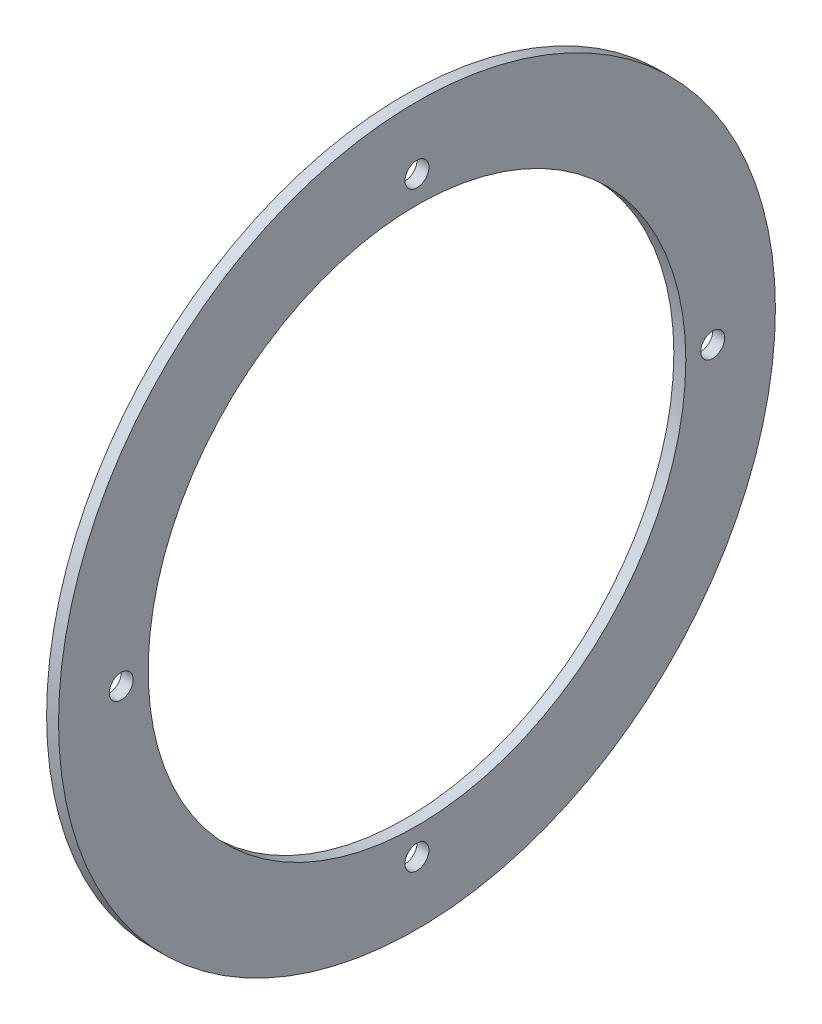
ISO-10303-21;
HEADER;
FILE_DESCRIPTION(('STEP AP214'),'2;1');
FILE_NAME('part.step','',(''),(''),'','','');
FILE_SCHEMA(('AUTOMOTIVE_DESIGN { 1 0 10303 214 1 1 1 1 }'));
ENDSEC;
DATA;
#1=APPLICATION_CONTEXT('core data for automotive mechanical design processes');
#2=APPLICATION_PROTOCOL_DEFINITION('international standard','automotive_design',2000,#1);
#3=PRODUCT_CONTEXT('',#1,'mechanical');
#4=PRODUCT('Part','Part','',(#3));
#5=PRODUCT_RELATED_PRODUCT_CATEGORY('part','',(#4));
#6=PRODUCT_DEFINITION_FORMATION('','',#4);
#7=PRODUCT_DEFINITION_CONTEXT('part definition',#1,'design');
#8=PRODUCT_DEFINITION('design','',#6,#7);
#9=PRODUCT_DEFINITION_SHAPE('','',#8);
#10=(LENGTH_UNIT() NAMED_UNIT(*) SI_UNIT(.MILLI.,.METRE.));
#11=(NAMED_UNIT(*) PLANE_ANGLE_UNIT() SI_UNIT($,.RADIAN.));
#12=(NAMED_UNIT(*) SI_UNIT($,.STERADIAN.) SOLID_ANGLE_UNIT());
#13=UNCERTAINTY_MEASURE_WITH_UNIT(LENGTH_MEASURE(1.E-05),#10,'distance_accuracy_value','');
#14=(GEOMETRIC_REPRESENTATION_CONTEXT(3) GLOBAL_UNCERTAINTY_ASSIGNED_CONTEXT((#13)) GLOBAL_UNIT_ASSIGNED_CONTEXT((#10,
#11,#12)) REPRESENTATION_CONTEXT('',''));
#15=CARTESIAN_POINT('',(0.,0.,0.));
#16=DIRECTION('',(0.,0.,1.));
#17=DIRECTION('',(1.,0.,0.));
#18=AXIS2_PLACEMENT_3D('',#15,#16,#17);
#19=CARTESIAN_POINT('',(2.,0.,0.));
#20=DIRECTION('',(1.,0.,0.));
#21=DIRECTION('',(0.,0.,-0.999999999999998));
#22=AXIS2_PLACEMENT_3D('',#19,#20,#21);
#23=PLANE('',#22);
#24=CARTESIAN_POINT('',(2.,-49.5,0.));
#25=DIRECTION('',(1.,0.,0.));
#26=DIRECTION('',(0.,0.,-0.999999999999998));
#27=AXIS2_PLACEMENT_3D('',#24,#25,#26);
#28=CIRCLE('',#27,2.);
#29=CARTESIAN_POINT('',(2.,-49.5,-1.99999999999997));
#30=VERTEX_POINT('',#29);
#31=EDGE_CURVE('E56',#30,#30,#28,.T.);
#32=ORIENTED_EDGE('',*,*,#31,.F.);
#33=EDGE_LOOP('',(#32));
#34=FACE_BOUND('',#33,.T.);
#35=CARTESIAN_POINT('',(2.00000000000022,49.5,0.));
#36=DIRECTION('',(1.,0.,0.));
#37=DIRECTION('',(0.,0.,-0.999999999999998));
#38=AXIS2_PLACEMENT_3D('',#35,#36,#37);
#39=CIRCLE('',#38,2.);
#40=CARTESIAN_POINT('',(2.00000000000022,49.5,-2.));
#41=VERTEX_POINT('',#40);
#42=EDGE_CURVE('E44',#41,#41,#39,.T.);
#43=ORIENTED_EDGE('',*,*,#42,.F.);
#44=EDGE_LOOP('',(#43));
#45=FACE_BOUND('',#44,.T.);
#46=CARTESIAN_POINT('',(2.,0.,0.));
#47=DIRECTION('',(1.,0.,0.));
#48=DIRECTION('',(0.,0.,-0.999999999999998));
#49=AXIS2_PLACEMENT_3D('',#46,#47,#48);
#50=CIRCLE('',#49,60.);
#51=CARTESIAN_POINT('',(2.,0.,-59.9999999999999));
#52=VERTEX_POINT('',#51);
#53=EDGE_CURVE('E10',#52,#52,#50,.T.);
#54=ORIENTED_EDGE('',*,*,#53,.T.);
#55=EDGE_LOOP('',(#54));
#56=FACE_BOUND('',#55,.T.);
#57=CARTESIAN_POINT('',(2.,0.,0.));
#58=DIRECTION('',(1.,0.,0.));
#59=DIRECTION('',(0.,0.,-0.999999999999998));
#60=AXIS2_PLACEMENT_3D('',#57,#58,#59);
#61=CIRCLE('',#60,45.);
#62=CARTESIAN_POINT('',(2.,0.,-44.9999999999999));
#63=VERTEX_POINT('',#62);
#64=EDGE_CURVE('E39',#63,#63,#61,.T.);
#65=ORIENTED_EDGE('',*,*,#64,.F.);
#66=EDGE_LOOP('',(#65));
#67=FACE_BOUND('',#66,.T.);
#68=CARTESIAN_POINT('',(2.,0.,49.5));
#69=DIRECTION('',(1.,0.,0.));
#70=DIRECTION('',(0.,0.,-0.999999999999998));
#71=AXIS2_PLACEMENT_3D('',#68,#69,#70);
#72=CIRCLE('',#71,2.);
#73=CARTESIAN_POINT('',(2.,0.,47.5));
#74=VERTEX_POINT('',#73);
#75=EDGE_CURVE('E50',#74,#74,#72,.T.);
#76=ORIENTED_EDGE('',*,*,#75,.F.);
#77=EDGE_LOOP('',(#76));
#78=FACE_BOUND('',#77,.T.);
#79=CARTESIAN_POINT('',(2.00000000000022,0.,-49.5));
#80=DIRECTION('',(1.,0.,0.));
#81=DIRECTION('',(0.,0.,-0.999999999999998));
#82=AXIS2_PLACEMENT_3D('',#79,#80,#81);
#83=CIRCLE('',#82,2.);
#84=CARTESIAN_POINT('',(2.00000000000022,0.,-51.5));
#85=VERTEX_POINT('',#84);
#86=EDGE_CURVE('E62',#85,#85,#83,.T.);
#87=ORIENTED_EDGE('',*,*,#86,.F.);
#88=EDGE_LOOP('',(#87));
#89=FACE_BOUND('',#88,.T.);
#90=ADVANCED_FACE('F28',(#34,#45,#56,#67,#78,#89),#23,.T.);
#91=CARTESIAN_POINT('',(0.,0.,0.));
#92=DIRECTION('',(1.,0.,0.));
#93=DIRECTION('',(0.,0.,-0.999999999999998));
#94=AXIS2_PLACEMENT_3D('',#91,#92,#93);
#95=PLANE('',#94);
#96=CARTESIAN_POINT('',(0.,-49.5,0.));
#97=DIRECTION('',(1.,0.,0.));
#98=DIRECTION('',(0.,0.,-0.999999999999998));
#99=AXIS2_PLACEMENT_3D('',#96,#97,#98);
#100=CIRCLE('',#99,2.);
#101=CARTESIAN_POINT('',(0.,-49.5,-1.99999999999997));
#102=VERTEX_POINT('',#101);
#103=EDGE_CURVE('E59',#102,#102,#100,.T.);
#104=ORIENTED_EDGE('',*,*,#103,.T.);
#105=EDGE_LOOP('',(#104));
#106=FACE_BOUND('',#105,.T.);
#107=CARTESIAN_POINT('',(2.22044604925031E-13,49.5,0.));
#108=DIRECTION('',(1.,0.,0.));
#109=DIRECTION('',(0.,0.,-0.999999999999998));
#110=AXIS2_PLACEMENT_3D('',#107,#108,#109);
#111=CIRCLE('',#110,2.);
#112=CARTESIAN_POINT('',(2.22044604925031E-13,49.5,-2.));
#113=VERTEX_POINT('',#112);
#114=EDGE_CURVE('E47',#113,#113,#111,.T.);
#115=ORIENTED_EDGE('',*,*,#114,.T.);
#116=EDGE_LOOP('',(#115));
#117=FACE_BOUND('',#116,.T.);
#118=CARTESIAN_POINT('',(0.,0.,0.));
#119=DIRECTION('',(1.,0.,0.));
#120=DIRECTION('',(0.,0.,-0.999999999999998));
#121=AXIS2_PLACEMENT_3D('',#118,#119,#120);
#122=CIRCLE('',#121,60.);
#123=CARTESIAN_POINT('',(0.,0.,-59.9999999999999));
#124=VERTEX_POINT('',#123);
#125=EDGE_CURVE('E32',#124,#124,#122,.T.);
#126=ORIENTED_EDGE('',*,*,#125,.F.);
#127=EDGE_LOOP('',(#126));
#128=FACE_BOUND('',#127,.T.);
#129=CARTESIAN_POINT('',(0.,0.,0.));
#130=DIRECTION('',(1.,0.,0.));
#131=DIRECTION('',(0.,0.,-0.999999999999998));
#132=AXIS2_PLACEMENT_3D('',#129,#130,#131);
#133=CIRCLE('',#132,45.);
#134=CARTESIAN_POINT('',(0.,0.,-44.9999999999999));
#135=VERTEX_POINT('',#134);
#136=EDGE_CURVE('E41',#135,#135,#133,.T.);
#137=ORIENTED_EDGE('',*,*,#136,.T.);
#138=EDGE_LOOP('',(#137));
#139=FACE_BOUND('',#138,.T.);
#140=CARTESIAN_POINT('',(0.,0.,49.5));
#141=DIRECTION('',(1.,0.,0.));
#142=DIRECTION('',(0.,0.,-0.999999999999998));
#143=AXIS2_PLACEMENT_3D('',#140,#141,#142);
#144=CIRCLE('',#143,2.);
#145=CARTESIAN_POINT('',(0.,0.,47.5));
#146=VERTEX_POINT('',#145);
#147=EDGE_CURVE('E53',#146,#146,#144,.T.);
#148=ORIENTED_EDGE('',*,*,#147,.T.);
#149=EDGE_LOOP('',(#148));
#150=FACE_BOUND('',#149,.T.);
#151=CARTESIAN_POINT('',(2.22044604925031E-13,0.,-49.5));
#152=DIRECTION('',(1.,0.,0.));
#153=DIRECTION('',(0.,0.,-0.999999999999998));
#154=AXIS2_PLACEMENT_3D('',#151,#152,#153);
#155=CIRCLE('',#154,2.);
#156=CARTESIAN_POINT('',(2.22044604925031E-13,0.,-51.5));
#157=VERTEX_POINT('',#156);
#158=EDGE_CURVE('E65',#157,#157,#155,.T.);
#159=ORIENTED_EDGE('',*,*,#158,.T.);
#160=EDGE_LOOP('',(#159));
#161=FACE_BOUND('',#160,.T.);
#162=ADVANCED_FACE('F75',(#106,#117,#128,#139,#150,#161),#95,.F.);
#163=CARTESIAN_POINT('',(2.,0.,0.));
#164=DIRECTION('',(-1.,0.,0.));
#165=DIRECTION('',(0.,0.,0.999999999999998));
#166=AXIS2_PLACEMENT_3D('',#163,#164,#165);
#167=CYLINDRICAL_SURFACE('',#166,60.);
#168=ORIENTED_EDGE('',*,*,#53,.F.);
#169=EDGE_LOOP('',(#168));
#170=FACE_BOUND('',#169,.T.);
#171=ORIENTED_EDGE('',*,*,#125,.T.);
#172=EDGE_LOOP('',(#171));
#173=FACE_BOUND('',#172,.T.);
#174=ADVANCED_FACE('F30',(#170,#173),#167,.T.);
#175=CARTESIAN_POINT('',(2.,0.,0.));
#176=DIRECTION('',(-1.,0.,0.));
#177=DIRECTION('',(0.,0.,0.999999999999998));
#178=AXIS2_PLACEMENT_3D('',#175,#176,#177);
#179=CYLINDRICAL_SURFACE('',#178,45.);
#180=ORIENTED_EDGE('',*,*,#64,.T.);
#181=EDGE_LOOP('',(#180));
#182=FACE_BOUND('',#181,.T.);
#183=ORIENTED_EDGE('',*,*,#136,.F.);
#184=EDGE_LOOP('',(#183));
#185=FACE_BOUND('',#184,.T.);
#186=ADVANCED_FACE('F85',(#182,#185),#179,.F.);
#187=CARTESIAN_POINT('',(2.00000000000022,49.5,0.));
#188=DIRECTION('',(-1.,0.,0.));
#189=DIRECTION('',(0.,0.,0.999999999999998));
#190=AXIS2_PLACEMENT_3D('',#187,#188,#189);
#191=CYLINDRICAL_SURFACE('',#190,2.);
#192=ORIENTED_EDGE('',*,*,#42,.T.);
#193=EDGE_LOOP('',(#192));
#194=FACE_BOUND('',#193,.T.);
#195=ORIENTED_EDGE('',*,*,#114,.F.);
#196=EDGE_LOOP('',(#195));
#197=FACE_BOUND('',#196,.T.);
#198=ADVANCED_FACE('F88',(#194,#197),#191,.F.);
#199=CARTESIAN_POINT('',(2.,0.,49.5));
#200=DIRECTION('',(-1.,0.,0.));
#201=DIRECTION('',(0.,0.,0.999999999999998));
#202=AXIS2_PLACEMENT_3D('',#199,#200,#201);
#203=CYLINDRICAL_SURFACE('',#202,2.);
#204=ORIENTED_EDGE('',*,*,#75,.T.);
#205=EDGE_LOOP('',(#204));
#206=FACE_BOUND('',#205,.T.);
#207=ORIENTED_EDGE('',*,*,#147,.F.);
#208=EDGE_LOOP('',(#207));
#209=FACE_BOUND('',#208,.T.);
#210=ADVANCED_FACE('F92',(#206,#209),#203,.F.);
#211=CARTESIAN_POINT('',(2.,-49.5,0.));
#212=DIRECTION('',(-1.,0.,0.));
#213=DIRECTION('',(0.,0.,0.999999999999998));
#214=AXIS2_PLACEMENT_3D('',#211,#212,#213);
#215=CYLINDRICAL_SURFACE('',#214,2.);
#216=ORIENTED_EDGE('',*,*,#31,.T.);
#217=EDGE_LOOP('',(#216));
#218=FACE_BOUND('',#217,.T.);
#219=ORIENTED_EDGE('',*,*,#103,.F.);
#220=EDGE_LOOP('',(#219));
#221=FACE_BOUND('',#220,.T.);
#222=ADVANCED_FACE('F96',(#218,#221),#215,.F.);
#223=CARTESIAN_POINT('',(2.00000000000022,0.,-49.5));
#224=DIRECTION('',(-1.,0.,0.));
#225=DIRECTION('',(0.,0.,0.999999999999998));
#226=AXIS2_PLACEMENT_3D('',#223,#224,#225);
#227=CYLINDRICAL_SURFACE('',#226,2.);
#228=ORIENTED_EDGE('',*,*,#86,.T.);
#229=EDGE_LOOP('',(#228));
#230=FACE_BOUND('',#229,.T.);
#231=ORIENTED_EDGE('',*,*,#158,.F.);
#232=EDGE_LOOP('',(#231));
#233=FACE_BOUND('',#232,.T.);
#234=ADVANCED_FACE('F71',(#230,#233),#227,.F.);
#235=CLOSED_SHELL('',(#90,#162,#174,#186,#198,#210,#222,#234));
#236=MANIFOLD_SOLID_BREP('B2',#235);
#237=ADVANCED_BREP_SHAPE_REPRESENTATION('',(#18,#236),#14);
#238=SHAPE_DEFINITION_REPRESENTATION(#9,#237);
ENDSEC;
END-ISO-10303-21;
